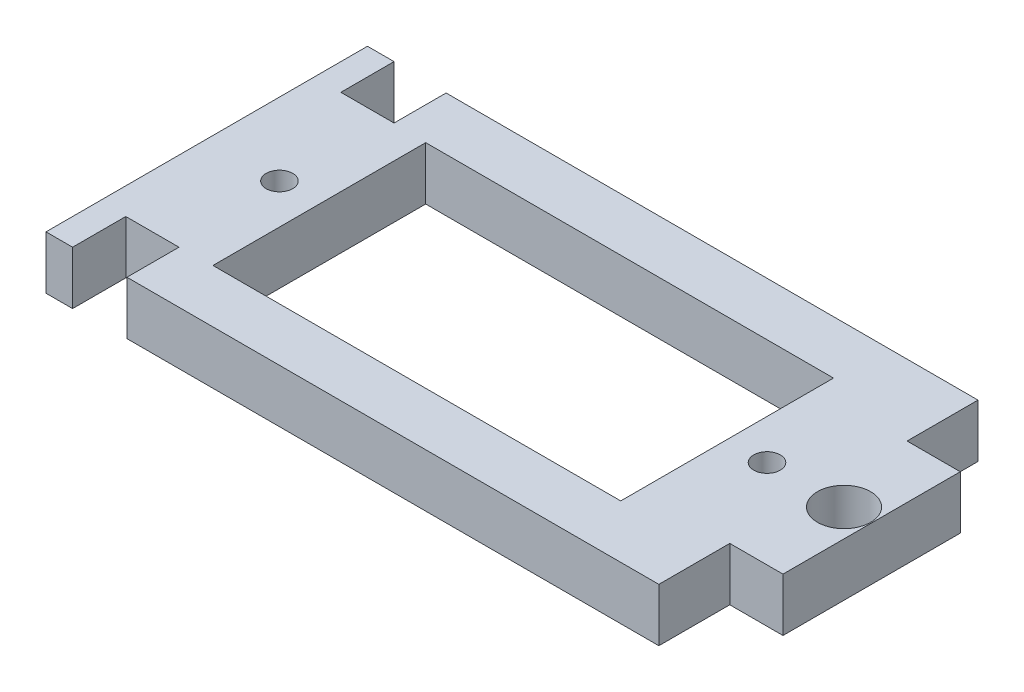
ISO-10303-21;
HEADER;
FILE_DESCRIPTION(('STEP AP214'),'2;1');
FILE_NAME('part.step','',(''),(''),'','','');
FILE_SCHEMA(('AUTOMOTIVE_DESIGN { 1 0 10303 214 1 1 1 1 }'));
ENDSEC;
DATA;
#1=APPLICATION_CONTEXT('core data for automotive mechanical design processes');
#2=APPLICATION_PROTOCOL_DEFINITION('international standard','automotive_design',2000,#1);
#3=PRODUCT_CONTEXT('',#1,'mechanical');
#4=PRODUCT('Part','Part','',(#3));
#5=PRODUCT_RELATED_PRODUCT_CATEGORY('part','',(#4));
#6=PRODUCT_DEFINITION_FORMATION('','',#4);
#7=PRODUCT_DEFINITION_CONTEXT('part definition',#1,'design');
#8=PRODUCT_DEFINITION('design','',#6,#7);
#9=PRODUCT_DEFINITION_SHAPE('','',#8);
#10=(LENGTH_UNIT() NAMED_UNIT(*) SI_UNIT(.MILLI.,.METRE.));
#11=(NAMED_UNIT(*) PLANE_ANGLE_UNIT() SI_UNIT($,.RADIAN.));
#12=(NAMED_UNIT(*) SI_UNIT($,.STERADIAN.) SOLID_ANGLE_UNIT());
#13=UNCERTAINTY_MEASURE_WITH_UNIT(LENGTH_MEASURE(1.E-05),#10,'distance_accuracy_value','');
#14=(GEOMETRIC_REPRESENTATION_CONTEXT(3) GLOBAL_UNCERTAINTY_ASSIGNED_CONTEXT((#13)) GLOBAL_UNIT_ASSIGNED_CONTEXT((#10,
#11,#12)) REPRESENTATION_CONTEXT('',''));
#15=CARTESIAN_POINT('',(0.,0.,0.));
#16=DIRECTION('',(0.,0.,1.));
#17=DIRECTION('',(1.,0.,0.));
#18=AXIS2_PLACEMENT_3D('',#15,#16,#17);
#19=CARTESIAN_POINT('',(-15.0163043478261,3.,0.));
#20=DIRECTION('',(-1.,0.,0.));
#21=DIRECTION('',(0.,0.,1.));
#22=AXIS2_PLACEMENT_3D('',#19,#20,#21);
#23=PLANE('',#22);
#24=DIRECTION('',(0.,0.,-1.));
#25=VECTOR('',#24,1.);
#26=CARTESIAN_POINT('',(-15.0163043478261,0.,0.));
#27=LINE('',#26,#25);
#28=CARTESIAN_POINT('',(-15.0163043478261,0.,3.));
#29=VERTEX_POINT('',#28);
#30=CARTESIAN_POINT('',(-15.0163043478261,0.,-15.1304347826087));
#31=VERTEX_POINT('',#30);
#32=EDGE_CURVE('E240',#29,#31,#27,.T.);
#33=ORIENTED_EDGE('',*,*,#32,.F.);
#34=DIRECTION('',(0.,-1.,0.));
#35=VECTOR('',#34,1.);
#36=CARTESIAN_POINT('',(-15.0163043478261,3.,3.));
#37=LINE('',#36,#35);
#38=CARTESIAN_POINT('',(-15.0163043478261,3.,3.));
#39=VERTEX_POINT('',#38);
#40=EDGE_CURVE('E11',#39,#29,#37,.T.);
#41=ORIENTED_EDGE('',*,*,#40,.F.);
#42=DIRECTION('',(0.,0.,-1.));
#43=VECTOR('',#42,1.);
#44=CARTESIAN_POINT('',(-15.0163043478261,3.,0.));
#45=LINE('',#44,#43);
#46=CARTESIAN_POINT('',(-15.0163043478261,3.,-15.1304347826087));
#47=VERTEX_POINT('',#46);
#48=EDGE_CURVE('E433',#39,#47,#45,.T.);
#49=ORIENTED_EDGE('',*,*,#48,.T.);
#50=DIRECTION('',(0.,-1.,0.));
#51=VECTOR('',#50,1.);
#52=CARTESIAN_POINT('',(-15.0163043478261,3.,-15.1304347826087));
#53=LINE('',#52,#51);
#54=EDGE_CURVE('E64',#47,#31,#53,.T.);
#55=ORIENTED_EDGE('',*,*,#54,.T.);
#56=EDGE_LOOP('',(#33,#41,#49,#55));
#57=FACE_BOUND('',#56,.T.);
#58=ADVANCED_FACE('F43',(#57),#23,.T.);
#59=CARTESIAN_POINT('',(0.,3.,3.));
#60=DIRECTION('',(0.,0.,-1.));
#61=DIRECTION('',(-1.,0.,0.));
#62=AXIS2_PLACEMENT_3D('',#59,#60,#61);
#63=PLANE('',#62);
#64=DIRECTION('',(1.,0.,0.));
#65=VECTOR('',#64,1.);
#66=CARTESIAN_POINT('',(0.,0.,3.));
#67=LINE('',#66,#65);
#68=CARTESIAN_POINT('',(-13.5163043478261,0.,3.));
#69=VERTEX_POINT('',#68);
#70=EDGE_CURVE('E239',#29,#69,#67,.T.);
#71=ORIENTED_EDGE('',*,*,#70,.T.);
#72=DIRECTION('',(0.,-1.,0.));
#73=VECTOR('',#72,1.);
#74=CARTESIAN_POINT('',(-13.5163043478261,3.,3.));
#75=LINE('',#74,#73);
#76=CARTESIAN_POINT('',(-13.5163043478261,3.,3.));
#77=VERTEX_POINT('',#76);
#78=EDGE_CURVE('E52',#77,#69,#75,.T.);
#79=ORIENTED_EDGE('',*,*,#78,.F.);
#80=DIRECTION('',(1.,0.,0.));
#81=VECTOR('',#80,1.);
#82=CARTESIAN_POINT('',(0.,3.,3.));
#83=LINE('',#82,#81);
#84=EDGE_CURVE('E434',#39,#77,#83,.T.);
#85=ORIENTED_EDGE('',*,*,#84,.F.);
#86=ORIENTED_EDGE('',*,*,#40,.T.);
#87=EDGE_LOOP('',(#71,#79,#85,#86));
#88=FACE_BOUND('',#87,.T.);
#89=ADVANCED_FACE('F346',(#88),#63,.F.);
#90=CARTESIAN_POINT('',(-13.5163043478261,3.,0.));
#91=DIRECTION('',(-1.,0.,0.));
#92=DIRECTION('',(0.,0.,1.));
#93=AXIS2_PLACEMENT_3D('',#90,#91,#92);
#94=PLANE('',#93);
#95=DIRECTION('',(0.,0.,-1.));
#96=VECTOR('',#95,1.);
#97=CARTESIAN_POINT('',(-13.5163043478261,0.,0.));
#98=LINE('',#97,#96);
#99=CARTESIAN_POINT('',(-13.5163043478261,0.,0.));
#100=VERTEX_POINT('',#99);
#101=EDGE_CURVE('E244',#69,#100,#98,.T.);
#102=ORIENTED_EDGE('',*,*,#101,.T.);
#103=DIRECTION('',(0.,-1.,0.));
#104=VECTOR('',#103,1.);
#105=CARTESIAN_POINT('',(-13.5163043478261,3.,0.));
#106=LINE('',#105,#104);
#107=CARTESIAN_POINT('',(-13.5163043478261,3.,0.));
#108=VERTEX_POINT('',#107);
#109=EDGE_CURVE('E306',#108,#100,#106,.T.);
#110=ORIENTED_EDGE('',*,*,#109,.F.);
#111=DIRECTION('',(0.,0.,-1.));
#112=VECTOR('',#111,1.);
#113=CARTESIAN_POINT('',(-13.5163043478261,3.,0.));
#114=LINE('',#113,#112);
#115=EDGE_CURVE('E437',#77,#108,#114,.T.);
#116=ORIENTED_EDGE('',*,*,#115,.F.);
#117=ORIENTED_EDGE('',*,*,#78,.T.);
#118=EDGE_LOOP('',(#102,#110,#116,#117));
#119=FACE_BOUND('',#118,.T.);
#120=ADVANCED_FACE('F352',(#119),#94,.F.);
#121=CARTESIAN_POINT('',(0.,3.,0.));
#122=DIRECTION('',(0.,0.,-1.));
#123=DIRECTION('',(-1.,0.,0.));
#124=AXIS2_PLACEMENT_3D('',#121,#122,#123);
#125=PLANE('',#124);
#126=DIRECTION('',(1.,0.,0.));
#127=VECTOR('',#126,1.);
#128=CARTESIAN_POINT('',(0.,0.,0.));
#129=LINE('',#128,#127);
#130=CARTESIAN_POINT('',(-10.5163043478261,0.,0.));
#131=VERTEX_POINT('',#130);
#132=EDGE_CURVE('E241',#100,#131,#129,.T.);
#133=ORIENTED_EDGE('',*,*,#132,.T.);
#134=DIRECTION('',(0.,-1.,0.));
#135=VECTOR('',#134,1.);
#136=CARTESIAN_POINT('',(-10.5163043478261,3.,0.));
#137=LINE('',#136,#135);
#138=CARTESIAN_POINT('',(-10.5163043478261,3.,0.));
#139=VERTEX_POINT('',#138);
#140=EDGE_CURVE('E303',#139,#131,#137,.T.);
#141=ORIENTED_EDGE('',*,*,#140,.F.);
#142=DIRECTION('',(1.,0.,0.));
#143=VECTOR('',#142,1.);
#144=CARTESIAN_POINT('',(0.,3.,0.));
#145=LINE('',#144,#143);
#146=EDGE_CURVE('E442',#108,#139,#145,.T.);
#147=ORIENTED_EDGE('',*,*,#146,.F.);
#148=ORIENTED_EDGE('',*,*,#109,.T.);
#149=EDGE_LOOP('',(#133,#141,#147,#148));
#150=FACE_BOUND('',#149,.T.);
#151=ADVANCED_FACE('F356',(#150),#125,.F.);
#152=CARTESIAN_POINT('',(-10.5163043478261,3.,0.));
#153=DIRECTION('',(1.,0.,0.));
#154=DIRECTION('',(0.,0.,-1.));
#155=AXIS2_PLACEMENT_3D('',#152,#153,#154);
#156=PLANE('',#155);
#157=DIRECTION('',(0.,0.,1.));
#158=VECTOR('',#157,1.);
#159=CARTESIAN_POINT('',(-10.5163043478261,0.,0.));
#160=LINE('',#159,#158);
#161=CARTESIAN_POINT('',(-10.5163043478261,0.,2.93478260869565));
#162=VERTEX_POINT('',#161);
#163=EDGE_CURVE('E249',#131,#162,#160,.T.);
#164=ORIENTED_EDGE('',*,*,#163,.T.);
#165=DIRECTION('',(0.,-1.,0.));
#166=VECTOR('',#165,1.);
#167=CARTESIAN_POINT('',(-10.5163043478261,3.,2.93478260869565));
#168=LINE('',#167,#166);
#169=CARTESIAN_POINT('',(-10.5163043478261,3.,2.93478260869565));
#170=VERTEX_POINT('',#169);
#171=EDGE_CURVE('E305',#170,#162,#168,.T.);
#172=ORIENTED_EDGE('',*,*,#171,.F.);
#173=DIRECTION('',(0.,0.,1.));
#174=VECTOR('',#173,1.);
#175=CARTESIAN_POINT('',(-10.5163043478261,3.,0.));
#176=LINE('',#175,#174);
#177=EDGE_CURVE('E441',#139,#170,#176,.T.);
#178=ORIENTED_EDGE('',*,*,#177,.F.);
#179=ORIENTED_EDGE('',*,*,#140,.T.);
#180=EDGE_LOOP('',(#164,#172,#178,#179));
#181=FACE_BOUND('',#180,.T.);
#182=ADVANCED_FACE('F361',(#181),#156,.F.);
#183=CARTESIAN_POINT('',(0.,3.,2.93478260869565));
#184=DIRECTION('',(0.,0.,-1.));
#185=DIRECTION('',(-1.,0.,0.));
#186=AXIS2_PLACEMENT_3D('',#183,#184,#185);
#187=PLANE('',#186);
#188=DIRECTION('',(1.,0.,0.));
#189=VECTOR('',#188,1.);
#190=CARTESIAN_POINT('',(0.,0.,2.93478260869565));
#191=LINE('',#190,#189);
#192=CARTESIAN_POINT('',(19.4836956521739,0.,2.93478260869565));
#193=VERTEX_POINT('',#192);
#194=EDGE_CURVE('E253',#162,#193,#191,.T.);
#195=ORIENTED_EDGE('',*,*,#194,.T.);
#196=DIRECTION('',(0.,-1.,0.));
#197=VECTOR('',#196,1.);
#198=CARTESIAN_POINT('',(19.4836956521739,3.,2.93478260869565));
#199=LINE('',#198,#197);
#200=CARTESIAN_POINT('',(19.4836956521739,3.,2.93478260869565));
#201=VERTEX_POINT('',#200);
#202=EDGE_CURVE('E300',#201,#193,#199,.T.);
#203=ORIENTED_EDGE('',*,*,#202,.F.);
#204=DIRECTION('',(1.,0.,0.));
#205=VECTOR('',#204,1.);
#206=CARTESIAN_POINT('',(0.,3.,2.93478260869565));
#207=LINE('',#206,#205);
#208=EDGE_CURVE('E449',#170,#201,#207,.T.);
#209=ORIENTED_EDGE('',*,*,#208,.F.);
#210=ORIENTED_EDGE('',*,*,#171,.T.);
#211=EDGE_LOOP('',(#195,#203,#209,#210));
#212=FACE_BOUND('',#211,.T.);
#213=ADVANCED_FACE('F370',(#212),#187,.F.);
#214=CARTESIAN_POINT('',(19.4836956521739,3.,0.));
#215=DIRECTION('',(-1.,0.,0.));
#216=DIRECTION('',(0.,0.,1.));
#217=AXIS2_PLACEMENT_3D('',#214,#215,#216);
#218=PLANE('',#217);
#219=DIRECTION('',(0.,0.,-1.));
#220=VECTOR('',#219,1.);
#221=CARTESIAN_POINT('',(19.4836956521739,0.,0.));
#222=LINE('',#221,#220);
#223=CARTESIAN_POINT('',(19.4836956521739,0.,-1.06521739130435));
#224=VERTEX_POINT('',#223);
#225=EDGE_CURVE('E255',#193,#224,#222,.T.);
#226=ORIENTED_EDGE('',*,*,#225,.T.);
#227=DIRECTION('',(0.,-1.,0.));
#228=VECTOR('',#227,1.);
#229=CARTESIAN_POINT('',(19.4836956521739,3.,-1.06521739130435));
#230=LINE('',#229,#228);
#231=CARTESIAN_POINT('',(19.4836956521739,3.,-1.06521739130435));
#232=VERTEX_POINT('',#231);
#233=EDGE_CURVE('E298',#232,#224,#230,.T.);
#234=ORIENTED_EDGE('',*,*,#233,.F.);
#235=DIRECTION('',(0.,0.,-1.));
#236=VECTOR('',#235,1.);
#237=CARTESIAN_POINT('',(19.4836956521739,3.,0.));
#238=LINE('',#237,#236);
#239=EDGE_CURVE('E446',#201,#232,#238,.T.);
#240=ORIENTED_EDGE('',*,*,#239,.F.);
#241=ORIENTED_EDGE('',*,*,#202,.T.);
#242=EDGE_LOOP('',(#226,#234,#240,#241));
#243=FACE_BOUND('',#242,.T.);
#244=ADVANCED_FACE('F371',(#243),#218,.F.);
#245=CARTESIAN_POINT('',(0.,3.,-1.06521739130435));
#246=DIRECTION('',(0.,0.,-1.));
#247=DIRECTION('',(-1.,0.,0.));
#248=AXIS2_PLACEMENT_3D('',#245,#246,#247);
#249=PLANE('',#248);
#250=DIRECTION('',(1.,0.,0.));
#251=VECTOR('',#250,1.);
#252=CARTESIAN_POINT('',(0.,0.,-1.06521739130435));
#253=LINE('',#252,#251);
#254=CARTESIAN_POINT('',(22.4836956521739,0.,-1.06521739130435));
#255=VERTEX_POINT('',#254);
#256=EDGE_CURVE('E260',#224,#255,#253,.T.);
#257=ORIENTED_EDGE('',*,*,#256,.T.);
#258=DIRECTION('',(0.,-1.,0.));
#259=VECTOR('',#258,1.);
#260=CARTESIAN_POINT('',(22.4836956521739,3.,-1.06521739130435));
#261=LINE('',#260,#259);
#262=CARTESIAN_POINT('',(22.4836956521739,3.,-1.06521739130435));
#263=VERTEX_POINT('',#262);
#264=EDGE_CURVE('E291',#263,#255,#261,.T.);
#265=ORIENTED_EDGE('',*,*,#264,.F.);
#266=DIRECTION('',(1.,0.,0.));
#267=VECTOR('',#266,1.);
#268=CARTESIAN_POINT('',(0.,3.,-1.06521739130435));
#269=LINE('',#268,#267);
#270=EDGE_CURVE('E454',#232,#263,#269,.T.);
#271=ORIENTED_EDGE('',*,*,#270,.F.);
#272=ORIENTED_EDGE('',*,*,#233,.T.);
#273=EDGE_LOOP('',(#257,#265,#271,#272));
#274=FACE_BOUND('',#273,.T.);
#275=ADVANCED_FACE('F374',(#274),#249,.F.);
#276=CARTESIAN_POINT('',(22.4836956521739,3.,0.));
#277=DIRECTION('',(-1.,0.,0.));
#278=DIRECTION('',(0.,0.,1.));
#279=AXIS2_PLACEMENT_3D('',#276,#277,#278);
#280=PLANE('',#279);
#281=DIRECTION('',(0.,0.,-1.));
#282=VECTOR('',#281,1.);
#283=CARTESIAN_POINT('',(22.4836956521739,0.,0.));
#284=LINE('',#283,#282);
#285=CARTESIAN_POINT('',(22.4836956521739,0.,-11.0652173913043));
#286=VERTEX_POINT('',#285);
#287=EDGE_CURVE('E257',#255,#286,#284,.T.);
#288=ORIENTED_EDGE('',*,*,#287,.T.);
#289=DIRECTION('',(0.,-1.,0.));
#290=VECTOR('',#289,1.);
#291=CARTESIAN_POINT('',(22.4836956521739,3.,-11.0652173913043));
#292=LINE('',#291,#290);
#293=CARTESIAN_POINT('',(22.4836956521739,3.,-11.0652173913043));
#294=VERTEX_POINT('',#293);
#295=EDGE_CURVE('E292',#294,#286,#292,.T.);
#296=ORIENTED_EDGE('',*,*,#295,.F.);
#297=DIRECTION('',(0.,0.,-1.));
#298=VECTOR('',#297,1.);
#299=CARTESIAN_POINT('',(22.4836956521739,3.,0.));
#300=LINE('',#299,#298);
#301=EDGE_CURVE('E457',#263,#294,#300,.T.);
#302=ORIENTED_EDGE('',*,*,#301,.F.);
#303=ORIENTED_EDGE('',*,*,#264,.T.);
#304=EDGE_LOOP('',(#288,#296,#302,#303));
#305=FACE_BOUND('',#304,.T.);
#306=ADVANCED_FACE('F377',(#305),#280,.F.);
#307=CARTESIAN_POINT('',(0.,3.,-11.0652173913043));
#308=DIRECTION('',(0.,0.,-1.));
#309=DIRECTION('',(-1.,0.,0.));
#310=AXIS2_PLACEMENT_3D('',#307,#308,#309);
#311=PLANE('',#310);
#312=DIRECTION('',(1.,0.,0.));
#313=VECTOR('',#312,1.);
#314=CARTESIAN_POINT('',(0.,0.,-11.0652173913043));
#315=LINE('',#314,#313);
#316=CARTESIAN_POINT('',(19.4836956521739,0.,-11.0652173913043));
#317=VERTEX_POINT('',#316);
#318=EDGE_CURVE('E263',#317,#286,#315,.T.);
#319=ORIENTED_EDGE('',*,*,#318,.F.);
#320=DIRECTION('',(0.,-1.,0.));
#321=VECTOR('',#320,1.);
#322=CARTESIAN_POINT('',(19.4836956521739,3.,-11.0652173913043));
#323=LINE('',#322,#321);
#324=CARTESIAN_POINT('',(19.4836956521739,3.,-11.0652173913043));
#325=VERTEX_POINT('',#324);
#326=EDGE_CURVE('E286',#325,#317,#323,.T.);
#327=ORIENTED_EDGE('',*,*,#326,.F.);
#328=DIRECTION('',(1.,0.,0.));
#329=VECTOR('',#328,1.);
#330=CARTESIAN_POINT('',(0.,3.,-11.0652173913043));
#331=LINE('',#330,#329);
#332=EDGE_CURVE('E456',#325,#294,#331,.T.);
#333=ORIENTED_EDGE('',*,*,#332,.T.);
#334=ORIENTED_EDGE('',*,*,#295,.T.);
#335=EDGE_LOOP('',(#319,#327,#333,#334));
#336=FACE_BOUND('',#335,.T.);
#337=ADVANCED_FACE('F382',(#336),#311,.T.);
#338=CARTESIAN_POINT('',(19.4836956521739,3.,0.));
#339=DIRECTION('',(1.,0.,0.));
#340=DIRECTION('',(0.,0.,-1.));
#341=AXIS2_PLACEMENT_3D('',#338,#339,#340);
#342=PLANE('',#341);
#343=DIRECTION('',(0.,0.,1.));
#344=VECTOR('',#343,1.);
#345=CARTESIAN_POINT('',(19.4836956521739,0.,0.));
#346=LINE('',#345,#344);
#347=CARTESIAN_POINT('',(19.4836956521739,0.,-15.0652173913043));
#348=VERTEX_POINT('',#347);
#349=EDGE_CURVE('E266',#348,#317,#346,.T.);
#350=ORIENTED_EDGE('',*,*,#349,.F.);
#351=DIRECTION('',(0.,-1.,0.));
#352=VECTOR('',#351,1.);
#353=CARTESIAN_POINT('',(19.4836956521739,3.,-15.0652173913043));
#354=LINE('',#353,#352);
#355=CARTESIAN_POINT('',(19.4836956521739,3.,-15.0652173913043));
#356=VERTEX_POINT('',#355);
#357=EDGE_CURVE('E290',#356,#348,#354,.T.);
#358=ORIENTED_EDGE('',*,*,#357,.F.);
#359=DIRECTION('',(0.,0.,1.));
#360=VECTOR('',#359,1.);
#361=CARTESIAN_POINT('',(19.4836956521739,3.,0.));
#362=LINE('',#361,#360);
#363=EDGE_CURVE('E463',#356,#325,#362,.T.);
#364=ORIENTED_EDGE('',*,*,#363,.T.);
#365=ORIENTED_EDGE('',*,*,#326,.T.);
#366=EDGE_LOOP('',(#350,#358,#364,#365));
#367=FACE_BOUND('',#366,.T.);
#368=ADVANCED_FACE('F390',(#367),#342,.T.);
#369=CARTESIAN_POINT('',(0.,3.,-15.0652173913043));
#370=DIRECTION('',(0.,0.,-1.));
#371=DIRECTION('',(-1.,0.,0.));
#372=AXIS2_PLACEMENT_3D('',#369,#370,#371);
#373=PLANE('',#372);
#374=DIRECTION('',(1.,0.,0.));
#375=VECTOR('',#374,1.);
#376=CARTESIAN_POINT('',(0.,0.,-15.0652173913043));
#377=LINE('',#376,#375);
#378=CARTESIAN_POINT('',(-10.5163043478261,0.,-15.0652173913043));
#379=VERTEX_POINT('',#378);
#380=EDGE_CURVE('E267',#379,#348,#377,.T.);
#381=ORIENTED_EDGE('',*,*,#380,.F.);
#382=DIRECTION('',(0.,-1.,0.));
#383=VECTOR('',#382,1.);
#384=CARTESIAN_POINT('',(-10.5163043478261,3.,-15.0652173913043));
#385=LINE('',#384,#383);
#386=CARTESIAN_POINT('',(-10.5163043478261,3.,-15.0652173913043));
#387=VERTEX_POINT('',#386);
#388=EDGE_CURVE('E281',#387,#379,#385,.T.);
#389=ORIENTED_EDGE('',*,*,#388,.F.);
#390=DIRECTION('',(1.,0.,0.));
#391=VECTOR('',#390,1.);
#392=CARTESIAN_POINT('',(0.,3.,-15.0652173913043));
#393=LINE('',#392,#391);
#394=EDGE_CURVE('E465',#387,#356,#393,.T.);
#395=ORIENTED_EDGE('',*,*,#394,.T.);
#396=ORIENTED_EDGE('',*,*,#357,.T.);
#397=EDGE_LOOP('',(#381,#389,#395,#396));
#398=FACE_BOUND('',#397,.T.);
#399=ADVANCED_FACE('F393',(#398),#373,.T.);
#400=CARTESIAN_POINT('',(-10.5163043478261,3.,0.));
#401=DIRECTION('',(-1.,0.,0.));
#402=DIRECTION('',(0.,0.,1.));
#403=AXIS2_PLACEMENT_3D('',#400,#401,#402);
#404=PLANE('',#403);
#405=DIRECTION('',(0.,0.,-1.));
#406=VECTOR('',#405,1.);
#407=CARTESIAN_POINT('',(-10.5163043478261,0.,0.));
#408=LINE('',#407,#406);
#409=CARTESIAN_POINT('',(-10.5163043478261,0.,-12.1304347826087));
#410=VERTEX_POINT('',#409);
#411=EDGE_CURVE('E275',#410,#379,#408,.T.);
#412=ORIENTED_EDGE('',*,*,#411,.F.);
#413=DIRECTION('',(0.,-1.,0.));
#414=VECTOR('',#413,1.);
#415=CARTESIAN_POINT('',(-10.5163043478261,3.,-12.1304347826087));
#416=LINE('',#415,#414);
#417=CARTESIAN_POINT('',(-10.5163043478261,3.,-12.1304347826087));
#418=VERTEX_POINT('',#417);
#419=EDGE_CURVE('E198',#418,#410,#416,.T.);
#420=ORIENTED_EDGE('',*,*,#419,.F.);
#421=DIRECTION('',(0.,0.,-1.));
#422=VECTOR('',#421,1.);
#423=CARTESIAN_POINT('',(-10.5163043478261,3.,0.));
#424=LINE('',#423,#422);
#425=EDGE_CURVE('E210',#418,#387,#424,.T.);
#426=ORIENTED_EDGE('',*,*,#425,.T.);
#427=ORIENTED_EDGE('',*,*,#388,.T.);
#428=EDGE_LOOP('',(#412,#420,#426,#427));
#429=FACE_BOUND('',#428,.T.);
#430=ADVANCED_FACE('F391',(#429),#404,.T.);
#431=CARTESIAN_POINT('',(0.,3.,-12.1304347826087));
#432=DIRECTION('',(0.,0.,-1.));
#433=DIRECTION('',(-1.,0.,0.));
#434=AXIS2_PLACEMENT_3D('',#431,#432,#433);
#435=PLANE('',#434);
#436=DIRECTION('',(1.,0.,0.));
#437=VECTOR('',#436,1.);
#438=CARTESIAN_POINT('',(0.,0.,-12.1304347826087));
#439=LINE('',#438,#437);
#440=CARTESIAN_POINT('',(-13.5163043478261,0.,-12.1304347826087));
#441=VERTEX_POINT('',#440);
#442=EDGE_CURVE('E195',#441,#410,#439,.T.);
#443=ORIENTED_EDGE('',*,*,#442,.F.);
#444=DIRECTION('',(0.,-1.,0.));
#445=VECTOR('',#444,1.);
#446=CARTESIAN_POINT('',(-13.5163043478261,3.,-12.1304347826087));
#447=LINE('',#446,#445);
#448=CARTESIAN_POINT('',(-13.5163043478261,3.,-12.1304347826087));
#449=VERTEX_POINT('',#448);
#450=EDGE_CURVE('E189',#449,#441,#447,.T.);
#451=ORIENTED_EDGE('',*,*,#450,.F.);
#452=DIRECTION('',(1.,0.,0.));
#453=VECTOR('',#452,1.);
#454=CARTESIAN_POINT('',(0.,3.,-12.1304347826087));
#455=LINE('',#454,#453);
#456=EDGE_CURVE('E186',#449,#418,#455,.T.);
#457=ORIENTED_EDGE('',*,*,#456,.T.);
#458=ORIENTED_EDGE('',*,*,#419,.T.);
#459=EDGE_LOOP('',(#443,#451,#457,#458));
#460=FACE_BOUND('',#459,.T.);
#461=ADVANCED_FACE('F190',(#460),#435,.T.);
#462=CARTESIAN_POINT('',(-13.5163043478261,3.,0.));
#463=DIRECTION('',(1.,0.,0.));
#464=DIRECTION('',(0.,0.,-1.));
#465=AXIS2_PLACEMENT_3D('',#462,#463,#464);
#466=PLANE('',#465);
#467=DIRECTION('',(0.,0.,1.));
#468=VECTOR('',#467,1.);
#469=CARTESIAN_POINT('',(-13.5163043478261,0.,0.));
#470=LINE('',#469,#468);
#471=CARTESIAN_POINT('',(-13.5163043478261,0.,-15.1304347826087));
#472=VERTEX_POINT('',#471);
#473=EDGE_CURVE('E277',#472,#441,#470,.T.);
#474=ORIENTED_EDGE('',*,*,#473,.F.);
#475=DIRECTION('',(0.,-1.,0.));
#476=VECTOR('',#475,1.);
#477=CARTESIAN_POINT('',(-13.5163043478261,3.,-15.1304347826087));
#478=LINE('',#477,#476);
#479=CARTESIAN_POINT('',(-13.5163043478261,3.,-15.1304347826087));
#480=VERTEX_POINT('',#479);
#481=EDGE_CURVE('E124',#480,#472,#478,.T.);
#482=ORIENTED_EDGE('',*,*,#481,.F.);
#483=DIRECTION('',(0.,0.,1.));
#484=VECTOR('',#483,1.);
#485=CARTESIAN_POINT('',(-13.5163043478261,3.,0.));
#486=LINE('',#485,#484);
#487=EDGE_CURVE('E204',#480,#449,#486,.T.);
#488=ORIENTED_EDGE('',*,*,#487,.T.);
#489=ORIENTED_EDGE('',*,*,#450,.T.);
#490=EDGE_LOOP('',(#474,#482,#488,#489));
#491=FACE_BOUND('',#490,.T.);
#492=ADVANCED_FACE('F207',(#491),#466,.T.);
#493=CARTESIAN_POINT('',(-8.66630434782608,3.,0.));
#494=DIRECTION('',(1.,0.,0.));
#495=DIRECTION('',(0.,0.,-1.));
#496=AXIS2_PLACEMENT_3D('',#493,#494,#495);
#497=PLANE('',#496);
#498=DIRECTION('',(0.,0.,1.));
#499=VECTOR('',#498,1.);
#500=CARTESIAN_POINT('',(-8.66630434782608,0.,0.));
#501=LINE('',#500,#499);
#502=CARTESIAN_POINT('',(-8.66630434782608,0.,-12.0652173913044));
#503=VERTEX_POINT('',#502);
#504=CARTESIAN_POINT('',(-8.66630434782608,0.,-0.0652173913043425));
#505=VERTEX_POINT('',#504);
#506=EDGE_CURVE('E223',#503,#505,#501,.T.);
#507=ORIENTED_EDGE('',*,*,#506,.F.);
#508=DIRECTION('',(0.,-1.,0.));
#509=VECTOR('',#508,1.);
#510=CARTESIAN_POINT('',(-8.66630434782608,3.,-12.0652173913044));
#511=LINE('',#510,#509);
#512=CARTESIAN_POINT('',(-8.66630434782608,3.,-12.0652173913044));
#513=VERTEX_POINT('',#512);
#514=EDGE_CURVE('E50',#513,#503,#511,.T.);
#515=ORIENTED_EDGE('',*,*,#514,.F.);
#516=DIRECTION('',(0.,0.,1.));
#517=VECTOR('',#516,1.);
#518=CARTESIAN_POINT('',(-8.66630434782608,3.,0.));
#519=LINE('',#518,#517);
#520=CARTESIAN_POINT('',(-8.66630434782608,3.,-0.0652173913043425));
#521=VERTEX_POINT('',#520);
#522=EDGE_CURVE('E329',#513,#521,#519,.T.);
#523=ORIENTED_EDGE('',*,*,#522,.T.);
#524=DIRECTION('',(0.,-1.,0.));
#525=VECTOR('',#524,1.);
#526=CARTESIAN_POINT('',(-8.66630434782608,3.,-0.0652173913043425));
#527=LINE('',#526,#525);
#528=EDGE_CURVE('E215',#521,#505,#527,.T.);
#529=ORIENTED_EDGE('',*,*,#528,.T.);
#530=EDGE_LOOP('',(#507,#515,#523,#529));
#531=FACE_BOUND('',#530,.T.);
#532=ADVANCED_FACE('F328',(#531),#497,.T.);
#533=CARTESIAN_POINT('',(0.,3.,-12.0652173913044));
#534=DIRECTION('',(0.,0.,-1.));
#535=DIRECTION('',(-1.,0.,0.));
#536=AXIS2_PLACEMENT_3D('',#533,#534,#535);
#537=PLANE('',#536);
#538=DIRECTION('',(1.,0.,0.));
#539=VECTOR('',#538,1.);
#540=CARTESIAN_POINT('',(0.,0.,-12.0652173913044));
#541=LINE('',#540,#539);
#542=CARTESIAN_POINT('',(14.3336956521739,0.,-12.0652173913044));
#543=VERTEX_POINT('',#542);
#544=EDGE_CURVE('E227',#503,#543,#541,.T.);
#545=ORIENTED_EDGE('',*,*,#544,.T.);
#546=DIRECTION('',(0.,-1.,0.));
#547=VECTOR('',#546,1.);
#548=CARTESIAN_POINT('',(14.3336956521739,3.,-12.0652173913044));
#549=LINE('',#548,#547);
#550=CARTESIAN_POINT('',(14.3336956521739,3.,-12.0652173913044));
#551=VERTEX_POINT('',#550);
#552=EDGE_CURVE('E312',#551,#543,#549,.T.);
#553=ORIENTED_EDGE('',*,*,#552,.F.);
#554=DIRECTION('',(1.,0.,0.));
#555=VECTOR('',#554,1.);
#556=CARTESIAN_POINT('',(0.,3.,-12.0652173913044));
#557=LINE('',#556,#555);
#558=EDGE_CURVE('E323',#513,#551,#557,.T.);
#559=ORIENTED_EDGE('',*,*,#558,.F.);
#560=ORIENTED_EDGE('',*,*,#514,.T.);
#561=EDGE_LOOP('',(#545,#553,#559,#560));
#562=FACE_BOUND('',#561,.T.);
#563=ADVANCED_FACE('F325',(#562),#537,.F.);
#564=CARTESIAN_POINT('',(14.3336956521739,3.,0.));
#565=DIRECTION('',(-1.,0.,0.));
#566=DIRECTION('',(0.,0.,1.));
#567=AXIS2_PLACEMENT_3D('',#564,#565,#566);
#568=PLANE('',#567);
#569=DIRECTION('',(0.,0.,-1.));
#570=VECTOR('',#569,1.);
#571=CARTESIAN_POINT('',(14.3336956521739,0.,0.));
#572=LINE('',#571,#570);
#573=CARTESIAN_POINT('',(14.3336956521739,0.,-0.0652173913043425));
#574=VERTEX_POINT('',#573);
#575=EDGE_CURVE('E232',#574,#543,#572,.T.);
#576=ORIENTED_EDGE('',*,*,#575,.F.);
#577=DIRECTION('',(0.,-1.,0.));
#578=VECTOR('',#577,1.);
#579=CARTESIAN_POINT('',(14.3336956521739,3.,-0.0652173913043425));
#580=LINE('',#579,#578);
#581=CARTESIAN_POINT('',(14.3336956521739,3.,-0.0652173913043425));
#582=VERTEX_POINT('',#581);
#583=EDGE_CURVE('E314',#582,#574,#580,.T.);
#584=ORIENTED_EDGE('',*,*,#583,.F.);
#585=DIRECTION('',(0.,0.,-1.));
#586=VECTOR('',#585,1.);
#587=CARTESIAN_POINT('',(14.3336956521739,3.,0.));
#588=LINE('',#587,#586);
#589=EDGE_CURVE('E426',#582,#551,#588,.T.);
#590=ORIENTED_EDGE('',*,*,#589,.T.);
#591=ORIENTED_EDGE('',*,*,#552,.T.);
#592=EDGE_LOOP('',(#576,#584,#590,#591));
#593=FACE_BOUND('',#592,.T.);
#594=ADVANCED_FACE('F339',(#593),#568,.T.);
#595=CARTESIAN_POINT('',(0.,3.,-0.0652173913043425));
#596=DIRECTION('',(0.,0.,-1.));
#597=DIRECTION('',(-1.,0.,0.));
#598=AXIS2_PLACEMENT_3D('',#595,#596,#597);
#599=PLANE('',#598);
#600=DIRECTION('',(1.,0.,0.));
#601=VECTOR('',#600,1.);
#602=CARTESIAN_POINT('',(0.,0.,-0.0652173913043425));
#603=LINE('',#602,#601);
#604=EDGE_CURVE('E231',#505,#574,#603,.T.);
#605=ORIENTED_EDGE('',*,*,#604,.F.);
#606=ORIENTED_EDGE('',*,*,#528,.F.);
#607=DIRECTION('',(1.,0.,0.));
#608=VECTOR('',#607,1.);
#609=CARTESIAN_POINT('',(0.,3.,-0.0652173913043425));
#610=LINE('',#609,#608);
#611=EDGE_CURVE('E333',#521,#582,#610,.T.);
#612=ORIENTED_EDGE('',*,*,#611,.T.);
#613=ORIENTED_EDGE('',*,*,#583,.T.);
#614=EDGE_LOOP('',(#605,#606,#612,#613));
#615=FACE_BOUND('',#614,.T.);
#616=ADVANCED_FACE('F331',(#615),#599,.T.);
#617=CARTESIAN_POINT('',(16.5836956521739,3.,-6.06521739130435));
#618=DIRECTION('',(0.,-1.,0.));
#619=DIRECTION('',(0.,0.,-1.));
#620=AXIS2_PLACEMENT_3D('',#617,#618,#619);
#621=CYLINDRICAL_SURFACE('',#620,0.749999999999998);
#622=CARTESIAN_POINT('',(16.5836956521739,3.,-6.06521739130435));
#623=DIRECTION('',(0.,1.,0.));
#624=DIRECTION('',(0.,0.,1.));
#625=AXIS2_PLACEMENT_3D('',#622,#623,#624);
#626=CIRCLE('',#625,0.749999999999998);
#627=CARTESIAN_POINT('',(16.5836956521739,3.,-5.31521739130435));
#628=VERTEX_POINT('',#627);
#629=EDGE_CURVE('E424',#628,#628,#626,.T.);
#630=ORIENTED_EDGE('',*,*,#629,.T.);
#631=EDGE_LOOP('',(#630));
#632=FACE_BOUND('',#631,.T.);
#633=CARTESIAN_POINT('',(16.5836956521739,0.,-6.06521739130435));
#634=DIRECTION('',(0.,1.,0.));
#635=DIRECTION('',(0.,0.,1.));
#636=AXIS2_PLACEMENT_3D('',#633,#634,#635);
#637=CIRCLE('',#636,0.749999999999998);
#638=CARTESIAN_POINT('',(16.5836956521739,0.,-5.31521739130435));
#639=VERTEX_POINT('',#638);
#640=EDGE_CURVE('E225',#639,#639,#637,.T.);
#641=ORIENTED_EDGE('',*,*,#640,.F.);
#642=EDGE_LOOP('',(#641));
#643=FACE_BOUND('',#642,.T.);
#644=ADVANCED_FACE('F341',(#632,#643),#621,.F.);
#645=CARTESIAN_POINT('',(-10.9163043478261,3.,-6.06521739130435));
#646=DIRECTION('',(0.,-1.,0.));
#647=DIRECTION('',(0.,0.,-1.));
#648=AXIS2_PLACEMENT_3D('',#645,#646,#647);
#649=CYLINDRICAL_SURFACE('',#648,0.75);
#650=CARTESIAN_POINT('',(-10.9163043478261,3.,-6.06521739130435));
#651=DIRECTION('',(0.,1.,0.));
#652=DIRECTION('',(0.,0.,1.));
#653=AXIS2_PLACEMENT_3D('',#650,#651,#652);
#654=CIRCLE('',#653,0.75);
#655=CARTESIAN_POINT('',(-10.9163043478261,3.,-5.31521739130435));
#656=VERTEX_POINT('',#655);
#657=EDGE_CURVE('E419',#656,#656,#654,.T.);
#658=ORIENTED_EDGE('',*,*,#657,.T.);
#659=EDGE_LOOP('',(#658));
#660=FACE_BOUND('',#659,.T.);
#661=CARTESIAN_POINT('',(-10.9163043478261,0.,-6.06521739130435));
#662=DIRECTION('',(0.,1.,0.));
#663=DIRECTION('',(0.,0.,1.));
#664=AXIS2_PLACEMENT_3D('',#661,#662,#663);
#665=CIRCLE('',#664,0.75);
#666=CARTESIAN_POINT('',(-10.9163043478261,0.,-5.31521739130435));
#667=VERTEX_POINT('',#666);
#668=EDGE_CURVE('E218',#667,#667,#665,.T.);
#669=ORIENTED_EDGE('',*,*,#668,.F.);
#670=EDGE_LOOP('',(#669));
#671=FACE_BOUND('',#670,.T.);
#672=ADVANCED_FACE('F486',(#660,#671),#649,.F.);
#673=CARTESIAN_POINT('',(20.9266769959253,3.,-6.06521739130435));
#674=DIRECTION('',(0.,-1.,0.));
#675=DIRECTION('',(0.,0.,-1.));
#676=AXIS2_PLACEMENT_3D('',#673,#674,#675);
#677=CYLINDRICAL_SURFACE('',#676,1.5);
#678=CARTESIAN_POINT('',(20.9266769959253,3.,-6.06521739130435));
#679=DIRECTION('',(0.,1.,0.));
#680=DIRECTION('',(0.,0.,1.));
#681=AXIS2_PLACEMENT_3D('',#678,#679,#680);
#682=CIRCLE('',#681,1.5);
#683=CARTESIAN_POINT('',(20.9266769959253,3.,-4.56521739130435));
#684=VERTEX_POINT('',#683);
#685=EDGE_CURVE('E283',#684,#684,#682,.T.);
#686=ORIENTED_EDGE('',*,*,#685,.T.);
#687=EDGE_LOOP('',(#686));
#688=FACE_BOUND('',#687,.T.);
#689=CARTESIAN_POINT('',(20.9266769959253,0.,-6.06521739130435));
#690=DIRECTION('',(0.,1.,0.));
#691=DIRECTION('',(0.,0.,1.));
#692=AXIS2_PLACEMENT_3D('',#689,#690,#691);
#693=CIRCLE('',#692,1.5);
#694=CARTESIAN_POINT('',(20.9266769959253,0.,-4.56521739130435));
#695=VERTEX_POINT('',#694);
#696=EDGE_CURVE('E216',#695,#695,#693,.T.);
#697=ORIENTED_EDGE('',*,*,#696,.F.);
#698=EDGE_LOOP('',(#697));
#699=FACE_BOUND('',#698,.T.);
#700=ADVANCED_FACE('F44',(#688,#699),#677,.F.);
#701=CARTESIAN_POINT('',(0.,3.,-15.1304347826087));
#702=DIRECTION('',(0.,0.,-1.));
#703=DIRECTION('',(-1.,0.,0.));
#704=AXIS2_PLACEMENT_3D('',#701,#702,#703);
#705=PLANE('',#704);
#706=DIRECTION('',(1.,0.,0.));
#707=VECTOR('',#706,1.);
#708=CARTESIAN_POINT('',(0.,0.,-15.1304347826087));
#709=LINE('',#708,#707);
#710=EDGE_CURVE('E279',#31,#472,#709,.T.);
#711=ORIENTED_EDGE('',*,*,#710,.F.);
#712=ORIENTED_EDGE('',*,*,#54,.F.);
#713=DIRECTION('',(1.,0.,0.));
#714=VECTOR('',#713,1.);
#715=CARTESIAN_POINT('',(0.,3.,-15.1304347826087));
#716=LINE('',#715,#714);
#717=EDGE_CURVE('E209',#47,#480,#716,.T.);
#718=ORIENTED_EDGE('',*,*,#717,.T.);
#719=ORIENTED_EDGE('',*,*,#481,.T.);
#720=EDGE_LOOP('',(#711,#712,#718,#719));
#721=FACE_BOUND('',#720,.T.);
#722=ADVANCED_FACE('F404',(#721),#705,.T.);
#723=CARTESIAN_POINT('',(0.,3.,0.));
#724=DIRECTION('',(0.,1.,0.));
#725=DIRECTION('',(0.,0.,1.));
#726=AXIS2_PLACEMENT_3D('',#723,#724,#725);
#727=PLANE('',#726);
#728=ORIENTED_EDGE('',*,*,#685,.F.);
#729=EDGE_LOOP('',(#728));
#730=FACE_BOUND('',#729,.T.);
#731=ORIENTED_EDGE('',*,*,#657,.F.);
#732=EDGE_LOOP('',(#731));
#733=FACE_BOUND('',#732,.T.);
#734=ORIENTED_EDGE('',*,*,#629,.F.);
#735=EDGE_LOOP('',(#734));
#736=FACE_BOUND('',#735,.T.);
#737=ORIENTED_EDGE('',*,*,#522,.F.);
#738=ORIENTED_EDGE('',*,*,#558,.T.);
#739=ORIENTED_EDGE('',*,*,#589,.F.);
#740=ORIENTED_EDGE('',*,*,#611,.F.);
#741=EDGE_LOOP('',(#737,#738,#739,#740));
#742=FACE_BOUND('',#741,.T.);
#743=ORIENTED_EDGE('',*,*,#48,.F.);
#744=ORIENTED_EDGE('',*,*,#84,.T.);
#745=ORIENTED_EDGE('',*,*,#115,.T.);
#746=ORIENTED_EDGE('',*,*,#146,.T.);
#747=ORIENTED_EDGE('',*,*,#177,.T.);
#748=ORIENTED_EDGE('',*,*,#208,.T.);
#749=ORIENTED_EDGE('',*,*,#239,.T.);
#750=ORIENTED_EDGE('',*,*,#270,.T.);
#751=ORIENTED_EDGE('',*,*,#301,.T.);
#752=ORIENTED_EDGE('',*,*,#332,.F.);
#753=ORIENTED_EDGE('',*,*,#363,.F.);
#754=ORIENTED_EDGE('',*,*,#394,.F.);
#755=ORIENTED_EDGE('',*,*,#425,.F.);
#756=ORIENTED_EDGE('',*,*,#456,.F.);
#757=ORIENTED_EDGE('',*,*,#487,.F.);
#758=ORIENTED_EDGE('',*,*,#717,.F.);
#759=EDGE_LOOP('',(#743,#744,#745,#746,#747,#748,#749,#750,#751,#752,#753,#754,#755,#756,#757,#758));
#760=FACE_BOUND('',#759,.T.);
#761=ADVANCED_FACE('F205',(#730,#733,#736,#742,#760),#727,.T.);
#762=CARTESIAN_POINT('',(0.,0.,0.));
#763=DIRECTION('',(0.,1.,0.));
#764=DIRECTION('',(0.,0.,1.));
#765=AXIS2_PLACEMENT_3D('',#762,#763,#764);
#766=PLANE('',#765);
#767=ORIENTED_EDGE('',*,*,#696,.T.);
#768=EDGE_LOOP('',(#767));
#769=FACE_BOUND('',#768,.T.);
#770=ORIENTED_EDGE('',*,*,#668,.T.);
#771=EDGE_LOOP('',(#770));
#772=FACE_BOUND('',#771,.T.);
#773=ORIENTED_EDGE('',*,*,#640,.T.);
#774=EDGE_LOOP('',(#773));
#775=FACE_BOUND('',#774,.T.);
#776=ORIENTED_EDGE('',*,*,#506,.T.);
#777=ORIENTED_EDGE('',*,*,#604,.T.);
#778=ORIENTED_EDGE('',*,*,#575,.T.);
#779=ORIENTED_EDGE('',*,*,#544,.F.);
#780=EDGE_LOOP('',(#776,#777,#778,#779));
#781=FACE_BOUND('',#780,.T.);
#782=ORIENTED_EDGE('',*,*,#32,.T.);
#783=ORIENTED_EDGE('',*,*,#710,.T.);
#784=ORIENTED_EDGE('',*,*,#473,.T.);
#785=ORIENTED_EDGE('',*,*,#442,.T.);
#786=ORIENTED_EDGE('',*,*,#411,.T.);
#787=ORIENTED_EDGE('',*,*,#380,.T.);
#788=ORIENTED_EDGE('',*,*,#349,.T.);
#789=ORIENTED_EDGE('',*,*,#318,.T.);
#790=ORIENTED_EDGE('',*,*,#287,.F.);
#791=ORIENTED_EDGE('',*,*,#256,.F.);
#792=ORIENTED_EDGE('',*,*,#225,.F.);
#793=ORIENTED_EDGE('',*,*,#194,.F.);
#794=ORIENTED_EDGE('',*,*,#163,.F.);
#795=ORIENTED_EDGE('',*,*,#132,.F.);
#796=ORIENTED_EDGE('',*,*,#101,.F.);
#797=ORIENTED_EDGE('',*,*,#70,.F.);
#798=EDGE_LOOP('',(#782,#783,#784,#785,#786,#787,#788,#789,#790,#791,#792,#793,#794,#795,#796,#797));
#799=FACE_BOUND('',#798,.T.);
#800=ADVANCED_FACE('F326',(#769,#772,#775,#781,#799),#766,.F.);
#801=CLOSED_SHELL('',(#58,#89,#120,#151,#182,#213,#244,#275,#306,#337,#368,#399,#430,#461,#492,
#532,#563,#594,#616,#644,#672,#700,#722,#761,#800));
#802=MANIFOLD_SOLID_BREP('B2',#801);
#803=ADVANCED_BREP_SHAPE_REPRESENTATION('',(#18,#802),#14);
#804=SHAPE_DEFINITION_REPRESENTATION(#9,#803);
ENDSEC;
END-ISO-10303-21;
